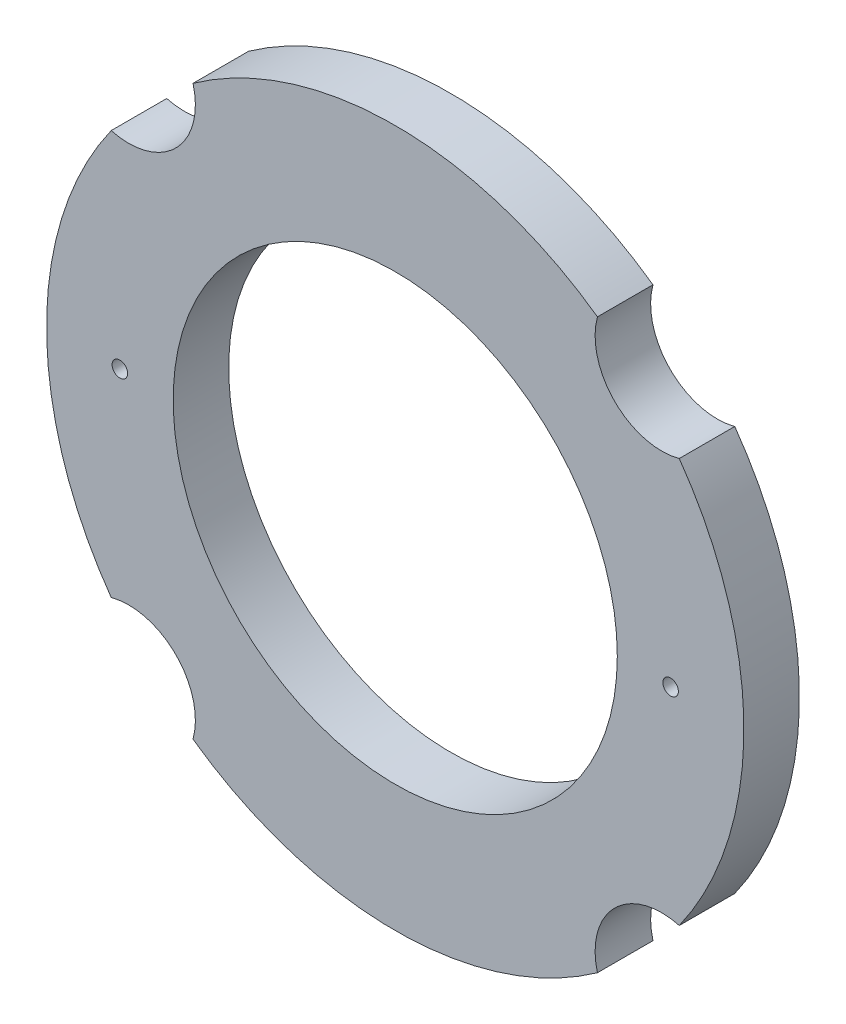
ISO-10303-21;
HEADER;
FILE_DESCRIPTION(('STEP AP214'),'2;1');
FILE_NAME('part.step','',(''),(''),'','','');
FILE_SCHEMA(('AUTOMOTIVE_DESIGN { 1 0 10303 214 1 1 1 1 }'));
ENDSEC;
DATA;
#1=APPLICATION_CONTEXT('core data for automotive mechanical design processes');
#2=APPLICATION_PROTOCOL_DEFINITION('international standard','automotive_design',2000,#1);
#3=PRODUCT_CONTEXT('',#1,'mechanical');
#4=PRODUCT('Part','Part','',(#3));
#5=PRODUCT_RELATED_PRODUCT_CATEGORY('part','',(#4));
#6=PRODUCT_DEFINITION_FORMATION('','',#4);
#7=PRODUCT_DEFINITION_CONTEXT('part definition',#1,'design');
#8=PRODUCT_DEFINITION('design','',#6,#7);
#9=PRODUCT_DEFINITION_SHAPE('','',#8);
#10=(LENGTH_UNIT() NAMED_UNIT(*) SI_UNIT(.MILLI.,.METRE.));
#11=(NAMED_UNIT(*) PLANE_ANGLE_UNIT() SI_UNIT($,.RADIAN.));
#12=(NAMED_UNIT(*) SI_UNIT($,.STERADIAN.) SOLID_ANGLE_UNIT());
#13=UNCERTAINTY_MEASURE_WITH_UNIT(LENGTH_MEASURE(1.E-05),#10,'distance_accuracy_value','');
#14=(GEOMETRIC_REPRESENTATION_CONTEXT(3) GLOBAL_UNCERTAINTY_ASSIGNED_CONTEXT((#13)) GLOBAL_UNIT_ASSIGNED_CONTEXT((#10,
#11,#12)) REPRESENTATION_CONTEXT('',''));
#15=CARTESIAN_POINT('',(0.,0.,0.));
#16=DIRECTION('',(0.,0.,1.));
#17=DIRECTION('',(1.,0.,0.));
#18=AXIS2_PLACEMENT_3D('',#15,#16,#17);
#19=CARTESIAN_POINT('',(0.,0.,0.));
#20=DIRECTION('',(0.,0.,1.));
#21=DIRECTION('',(1.,0.,0.));
#22=AXIS2_PLACEMENT_3D('',#19,#20,#21);
#23=PLANE('',#22);
#24=CARTESIAN_POINT('',(0.,0.,0.));
#25=DIRECTION('',(0.,0.,1.));
#26=DIRECTION('',(1.,0.,0.));
#27=AXIS2_PLACEMENT_3D('',#24,#25,#26);
#28=CIRCLE('',#27,50.);
#29=CARTESIAN_POINT('',(50.,0.,0.));
#30=VERTEX_POINT('',#29);
#31=EDGE_CURVE('E164',#30,#30,#28,.T.);
#32=ORIENTED_EDGE('',*,*,#31,.T.);
#33=EDGE_LOOP('',(#32));
#34=FACE_BOUND('',#33,.T.);
#35=CARTESIAN_POINT('',(-60.0000000000006,-59.9999999999993,0.));
#36=DIRECTION('',(0.,0.,1.));
#37=DIRECTION('',(1.,0.,0.));
#38=AXIS2_PLACEMENT_3D('',#35,#36,#37);
#39=CIRCLE('',#38,15.);
#40=CARTESIAN_POINT('',(-45.5289240738138,-63.9481592595197,0.));
#41=VERTEX_POINT('',#40);
#42=CARTESIAN_POINT('',(-63.9481592595207,-45.5289240738124,0.));
#43=VERTEX_POINT('',#42);
#44=EDGE_CURVE('E147',#41,#43,#39,.T.);
#45=ORIENTED_EDGE('',*,*,#44,.T.);
#46=CARTESIAN_POINT('',(0.,0.,0.));
#47=DIRECTION('',(0.,0.,1.));
#48=DIRECTION('',(1.,0.,0.));
#49=AXIS2_PLACEMENT_3D('',#46,#47,#48);
#50=CIRCLE('',#49,78.5);
#51=CARTESIAN_POINT('',(-63.9481592595202,45.5289240738131,0.));
#52=VERTEX_POINT('',#51);
#53=EDGE_CURVE('E155',#52,#43,#50,.T.);
#54=ORIENTED_EDGE('',*,*,#53,.F.);
#55=CARTESIAN_POINT('',(-60.,60.,0.));
#56=DIRECTION('',(0.,0.,1.));
#57=DIRECTION('',(1.,0.,0.));
#58=AXIS2_PLACEMENT_3D('',#55,#56,#57);
#59=CIRCLE('',#58,15.);
#60=CARTESIAN_POINT('',(-45.5289240738131,63.9481592595202,0.));
#61=VERTEX_POINT('',#60);
#62=EDGE_CURVE('E162',#52,#61,#59,.T.);
#63=ORIENTED_EDGE('',*,*,#62,.T.);
#64=CARTESIAN_POINT('',(45.5289240738134,63.94815925952,0.));
#65=VERTEX_POINT('',#64);
#66=EDGE_CURVE('E126',#65,#61,#50,.T.);
#67=ORIENTED_EDGE('',*,*,#66,.F.);
#68=CARTESIAN_POINT('',(60.0000000000002,59.9999999999998,0.));
#69=DIRECTION('',(0.,0.,1.));
#70=DIRECTION('',(1.,0.,0.));
#71=AXIS2_PLACEMENT_3D('',#68,#69,#70);
#72=CIRCLE('',#71,15.);
#73=CARTESIAN_POINT('',(63.9481592595204,45.5289240738129,0.));
#74=VERTEX_POINT('',#73);
#75=EDGE_CURVE('E159',#65,#74,#72,.T.);
#76=ORIENTED_EDGE('',*,*,#75,.T.);
#77=CARTESIAN_POINT('',(63.9481592595199,-45.5289240738136,0.));
#78=VERTEX_POINT('',#77);
#79=EDGE_CURVE('E156',#78,#74,#50,.T.);
#80=ORIENTED_EDGE('',*,*,#79,.F.);
#81=CARTESIAN_POINT('',(59.9999999999996,-60.0000000000004,0.));
#82=DIRECTION('',(0.,0.,1.));
#83=DIRECTION('',(1.,0.,0.));
#84=AXIS2_PLACEMENT_3D('',#81,#82,#83);
#85=CIRCLE('',#84,15.);
#86=CARTESIAN_POINT('',(45.5289240738127,-63.9481592595205,0.));
#87=VERTEX_POINT('',#86);
#88=EDGE_CURVE('E154',#78,#87,#85,.T.);
#89=ORIENTED_EDGE('',*,*,#88,.T.);
#90=EDGE_CURVE('E150',#41,#87,#50,.T.);
#91=ORIENTED_EDGE('',*,*,#90,.F.);
#92=EDGE_LOOP('',(#45,#54,#63,#67,#76,#80,#89,#91));
#93=FACE_BOUND('',#92,.T.);
#94=CARTESIAN_POINT('',(62.,0.,0.));
#95=DIRECTION('',(0.,0.,1.));
#96=DIRECTION('',(1.,0.,0.));
#97=AXIS2_PLACEMENT_3D('',#94,#95,#96);
#98=CIRCLE('',#97,5.);
#99=CARTESIAN_POINT('',(67.,0.,0.));
#100=VERTEX_POINT('',#99);
#101=EDGE_CURVE('E330',#100,#100,#98,.F.);
#102=ORIENTED_EDGE('',*,*,#101,.F.);
#103=EDGE_LOOP('',(#102));
#104=FACE_BOUND('',#103,.T.);
#105=CARTESIAN_POINT('',(-62.,0.,0.));
#106=DIRECTION('',(0.,0.,1.));
#107=DIRECTION('',(1.,0.,0.));
#108=AXIS2_PLACEMENT_3D('',#105,#106,#107);
#109=CIRCLE('',#108,5.);
#110=CARTESIAN_POINT('',(-57.,0.,0.));
#111=VERTEX_POINT('',#110);
#112=EDGE_CURVE('E321',#111,#111,#109,.T.);
#113=ORIENTED_EDGE('',*,*,#112,.T.);
#114=EDGE_LOOP('',(#113));
#115=FACE_BOUND('',#114,.T.);
#116=ADVANCED_FACE('F41',(#34,#93,#104,#115),#23,.F.);
#117=CARTESIAN_POINT('',(-60.0000000000006,-59.9999999999993,12.5));
#118=DIRECTION('',(0.,0.,-1.));
#119=DIRECTION('',(-1.,0.,0.));
#120=AXIS2_PLACEMENT_3D('',#117,#118,#119);
#121=CYLINDRICAL_SURFACE('',#120,15.);
#122=ORIENTED_EDGE('',*,*,#44,.F.);
#123=DIRECTION('',(0.,0.,-1.));
#124=VECTOR('',#123,1.);
#125=CARTESIAN_POINT('',(-45.5289240738138,-63.9481592595197,12.5));
#126=LINE('',#125,#124);
#127=CARTESIAN_POINT('',(-45.5289240738138,-63.9481592595197,12.5));
#128=VERTEX_POINT('',#127);
#129=EDGE_CURVE('E11',#128,#41,#126,.T.);
#130=ORIENTED_EDGE('',*,*,#129,.F.);
#131=CARTESIAN_POINT('',(-60.0000000000006,-59.9999999999993,12.5));
#132=DIRECTION('',(0.,0.,1.));
#133=DIRECTION('',(1.,0.,0.));
#134=AXIS2_PLACEMENT_3D('',#131,#132,#133);
#135=CIRCLE('',#134,15.);
#136=CARTESIAN_POINT('',(-63.9481592595207,-45.5289240738124,12.5));
#137=VERTEX_POINT('',#136);
#138=EDGE_CURVE('E167',#128,#137,#135,.T.);
#139=ORIENTED_EDGE('',*,*,#138,.T.);
#140=DIRECTION('',(0.,0.,-1.));
#141=VECTOR('',#140,1.);
#142=CARTESIAN_POINT('',(-63.9481592595207,-45.5289240738124,12.5));
#143=LINE('',#142,#141);
#144=EDGE_CURVE('E92',#137,#43,#143,.T.);
#145=ORIENTED_EDGE('',*,*,#144,.T.);
#146=EDGE_LOOP('',(#122,#130,#139,#145));
#147=FACE_BOUND('',#146,.T.);
#148=ADVANCED_FACE('F43',(#147),#121,.F.);
#149=CARTESIAN_POINT('',(0.,0.,12.5));
#150=DIRECTION('',(0.,0.,-1.));
#151=DIRECTION('',(-1.,0.,0.));
#152=AXIS2_PLACEMENT_3D('',#149,#150,#151);
#153=CYLINDRICAL_SURFACE('',#152,78.5);
#154=ORIENTED_EDGE('',*,*,#90,.T.);
#155=DIRECTION('',(0.,0.,-1.));
#156=VECTOR('',#155,1.);
#157=CARTESIAN_POINT('',(45.5289240738127,-63.9481592595205,12.5));
#158=LINE('',#157,#156);
#159=CARTESIAN_POINT('',(45.5289240738127,-63.9481592595205,12.5));
#160=VERTEX_POINT('',#159);
#161=EDGE_CURVE('E50',#160,#87,#158,.T.);
#162=ORIENTED_EDGE('',*,*,#161,.F.);
#163=CARTESIAN_POINT('',(0.,0.,12.5));
#164=DIRECTION('',(0.,0.,1.));
#165=DIRECTION('',(1.,0.,0.));
#166=AXIS2_PLACEMENT_3D('',#163,#164,#165);
#167=CIRCLE('',#166,78.5);
#168=EDGE_CURVE('E135',#128,#160,#167,.T.);
#169=ORIENTED_EDGE('',*,*,#168,.F.);
#170=ORIENTED_EDGE('',*,*,#129,.T.);
#171=EDGE_LOOP('',(#154,#162,#169,#170));
#172=FACE_BOUND('',#171,.T.);
#173=ADVANCED_FACE('F183',(#172),#153,.T.);
#174=CARTESIAN_POINT('',(59.9999999999996,-60.0000000000004,12.5));
#175=DIRECTION('',(0.,0.,-1.));
#176=DIRECTION('',(-1.,0.,0.));
#177=AXIS2_PLACEMENT_3D('',#174,#175,#176);
#178=CYLINDRICAL_SURFACE('',#177,15.);
#179=ORIENTED_EDGE('',*,*,#88,.F.);
#180=DIRECTION('',(0.,0.,-1.));
#181=VECTOR('',#180,1.);
#182=CARTESIAN_POINT('',(63.9481592595199,-45.5289240738136,12.5));
#183=LINE('',#182,#181);
#184=CARTESIAN_POINT('',(63.9481592595199,-45.5289240738136,12.5));
#185=VERTEX_POINT('',#184);
#186=EDGE_CURVE('E173',#185,#78,#183,.T.);
#187=ORIENTED_EDGE('',*,*,#186,.F.);
#188=CARTESIAN_POINT('',(59.9999999999996,-60.0000000000004,12.5));
#189=DIRECTION('',(0.,0.,1.));
#190=DIRECTION('',(1.,0.,0.));
#191=AXIS2_PLACEMENT_3D('',#188,#189,#190);
#192=CIRCLE('',#191,15.);
#193=EDGE_CURVE('E180',#185,#160,#192,.T.);
#194=ORIENTED_EDGE('',*,*,#193,.T.);
#195=ORIENTED_EDGE('',*,*,#161,.T.);
#196=EDGE_LOOP('',(#179,#187,#194,#195));
#197=FACE_BOUND('',#196,.T.);
#198=ADVANCED_FACE('F178',(#197),#178,.F.);
#199=ORIENTED_EDGE('',*,*,#79,.T.);
#200=DIRECTION('',(0.,0.,-1.));
#201=VECTOR('',#200,1.);
#202=CARTESIAN_POINT('',(63.9481592595204,45.5289240738129,12.5));
#203=LINE('',#202,#201);
#204=CARTESIAN_POINT('',(63.9481592595204,45.5289240738129,12.5));
#205=VERTEX_POINT('',#204);
#206=EDGE_CURVE('E171',#205,#74,#203,.T.);
#207=ORIENTED_EDGE('',*,*,#206,.F.);
#208=EDGE_CURVE('E121',#185,#205,#167,.T.);
#209=ORIENTED_EDGE('',*,*,#208,.F.);
#210=ORIENTED_EDGE('',*,*,#186,.T.);
#211=EDGE_LOOP('',(#199,#207,#209,#210));
#212=FACE_BOUND('',#211,.T.);
#213=ADVANCED_FACE('F197',(#212),#153,.T.);
#214=CARTESIAN_POINT('',(60.0000000000002,59.9999999999998,12.5));
#215=DIRECTION('',(0.,0.,-1.));
#216=DIRECTION('',(-1.,0.,0.));
#217=AXIS2_PLACEMENT_3D('',#214,#215,#216);
#218=CYLINDRICAL_SURFACE('',#217,15.);
#219=ORIENTED_EDGE('',*,*,#75,.F.);
#220=DIRECTION('',(0.,0.,-1.));
#221=VECTOR('',#220,1.);
#222=CARTESIAN_POINT('',(45.5289240738134,63.94815925952,12.5));
#223=LINE('',#222,#221);
#224=CARTESIAN_POINT('',(45.5289240738134,63.94815925952,12.5));
#225=VERTEX_POINT('',#224);
#226=EDGE_CURVE('E130',#225,#65,#223,.T.);
#227=ORIENTED_EDGE('',*,*,#226,.F.);
#228=CARTESIAN_POINT('',(60.0000000000002,59.9999999999998,12.5));
#229=DIRECTION('',(0.,0.,1.));
#230=DIRECTION('',(1.,0.,0.));
#231=AXIS2_PLACEMENT_3D('',#228,#229,#230);
#232=CIRCLE('',#231,15.);
#233=EDGE_CURVE('E118',#225,#205,#232,.T.);
#234=ORIENTED_EDGE('',*,*,#233,.T.);
#235=ORIENTED_EDGE('',*,*,#206,.T.);
#236=EDGE_LOOP('',(#219,#227,#234,#235));
#237=FACE_BOUND('',#236,.T.);
#238=ADVANCED_FACE('F222',(#237),#218,.F.);
#239=ORIENTED_EDGE('',*,*,#66,.T.);
#240=DIRECTION('',(0.,0.,-1.));
#241=VECTOR('',#240,1.);
#242=CARTESIAN_POINT('',(-45.5289240738131,63.9481592595202,12.5));
#243=LINE('',#242,#241);
#244=CARTESIAN_POINT('',(-45.5289240738131,63.9481592595202,12.5));
#245=VERTEX_POINT('',#244);
#246=EDGE_CURVE('E123',#245,#61,#243,.T.);
#247=ORIENTED_EDGE('',*,*,#246,.F.);
#248=EDGE_CURVE('E111',#225,#245,#167,.T.);
#249=ORIENTED_EDGE('',*,*,#248,.F.);
#250=ORIENTED_EDGE('',*,*,#226,.T.);
#251=EDGE_LOOP('',(#239,#247,#249,#250));
#252=FACE_BOUND('',#251,.T.);
#253=ADVANCED_FACE('F124',(#252),#153,.T.);
#254=CARTESIAN_POINT('',(-60.,60.,12.5));
#255=DIRECTION('',(0.,0.,-1.));
#256=DIRECTION('',(-1.,0.,0.));
#257=AXIS2_PLACEMENT_3D('',#254,#255,#256);
#258=CYLINDRICAL_SURFACE('',#257,15.);
#259=ORIENTED_EDGE('',*,*,#62,.F.);
#260=DIRECTION('',(0.,0.,-1.));
#261=VECTOR('',#260,1.);
#262=CARTESIAN_POINT('',(-63.9481592595202,45.5289240738131,12.5));
#263=LINE('',#262,#261);
#264=CARTESIAN_POINT('',(-63.9481592595202,45.5289240738131,12.5));
#265=VERTEX_POINT('',#264);
#266=EDGE_CURVE('E85',#265,#52,#263,.T.);
#267=ORIENTED_EDGE('',*,*,#266,.F.);
#268=CARTESIAN_POINT('',(-60.,60.,12.5));
#269=DIRECTION('',(0.,0.,1.));
#270=DIRECTION('',(1.,0.,0.));
#271=AXIS2_PLACEMENT_3D('',#268,#269,#270);
#272=CIRCLE('',#271,15.);
#273=EDGE_CURVE('E116',#265,#245,#272,.T.);
#274=ORIENTED_EDGE('',*,*,#273,.T.);
#275=ORIENTED_EDGE('',*,*,#246,.T.);
#276=EDGE_LOOP('',(#259,#267,#274,#275));
#277=FACE_BOUND('',#276,.T.);
#278=ADVANCED_FACE('F132',(#277),#258,.F.);
#279=CARTESIAN_POINT('',(62.,0.,12.5));
#280=DIRECTION('',(0.,0.,-1.));
#281=DIRECTION('',(-1.,0.,0.));
#282=AXIS2_PLACEMENT_3D('',#279,#280,#281);
#283=CYLINDRICAL_SURFACE('',#282,1.75);
#284=CARTESIAN_POINT('',(62.,0.,4.));
#285=DIRECTION('',(0.,0.,1.));
#286=DIRECTION('',(1.,0.,0.));
#287=AXIS2_PLACEMENT_3D('',#284,#285,#286);
#288=CIRCLE('',#287,1.75);
#289=CARTESIAN_POINT('',(63.75,0.,4.));
#290=VERTEX_POINT('',#289);
#291=EDGE_CURVE('E327',#290,#290,#288,.T.);
#292=ORIENTED_EDGE('',*,*,#291,.F.);
#293=EDGE_LOOP('',(#292));
#294=FACE_BOUND('',#293,.T.);
#295=CARTESIAN_POINT('',(62.,0.,12.5));
#296=DIRECTION('',(0.,0.,1.));
#297=DIRECTION('',(1.,0.,0.));
#298=AXIS2_PLACEMENT_3D('',#295,#296,#297);
#299=CIRCLE('',#298,1.75);
#300=CARTESIAN_POINT('',(63.75,0.,12.5));
#301=VERTEX_POINT('',#300);
#302=EDGE_CURVE('E141',#301,#301,#299,.T.);
#303=ORIENTED_EDGE('',*,*,#302,.T.);
#304=EDGE_LOOP('',(#303));
#305=FACE_BOUND('',#304,.T.);
#306=ADVANCED_FACE('F212',(#294,#305),#283,.F.);
#307=CARTESIAN_POINT('',(0.,0.,12.5));
#308=DIRECTION('',(0.,0.,-1.));
#309=DIRECTION('',(-1.,0.,0.));
#310=AXIS2_PLACEMENT_3D('',#307,#308,#309);
#311=CYLINDRICAL_SURFACE('',#310,50.);
#312=CARTESIAN_POINT('',(0.,0.,12.5));
#313=DIRECTION('',(0.,0.,1.));
#314=DIRECTION('',(1.,0.,0.));
#315=AXIS2_PLACEMENT_3D('',#312,#313,#314);
#316=CIRCLE('',#315,50.);
#317=CARTESIAN_POINT('',(50.,0.,12.5));
#318=VERTEX_POINT('',#317);
#319=EDGE_CURVE('E134',#318,#318,#316,.T.);
#320=ORIENTED_EDGE('',*,*,#319,.T.);
#321=EDGE_LOOP('',(#320));
#322=FACE_BOUND('',#321,.T.);
#323=ORIENTED_EDGE('',*,*,#31,.F.);
#324=EDGE_LOOP('',(#323));
#325=FACE_BOUND('',#324,.T.);
#326=ADVANCED_FACE('F214',(#322,#325),#311,.F.);
#327=ORIENTED_EDGE('',*,*,#53,.T.);
#328=ORIENTED_EDGE('',*,*,#144,.F.);
#329=EDGE_CURVE('E58',#265,#137,#167,.T.);
#330=ORIENTED_EDGE('',*,*,#329,.F.);
#331=ORIENTED_EDGE('',*,*,#266,.T.);
#332=EDGE_LOOP('',(#327,#328,#330,#331));
#333=FACE_BOUND('',#332,.T.);
#334=ADVANCED_FACE('F191',(#333),#153,.T.);
#335=CARTESIAN_POINT('',(-62.,0.,12.5));
#336=DIRECTION('',(0.,0.,-1.));
#337=DIRECTION('',(-1.,0.,0.));
#338=AXIS2_PLACEMENT_3D('',#335,#336,#337);
#339=CYLINDRICAL_SURFACE('',#338,1.75);
#340=CARTESIAN_POINT('',(-62.,0.,4.));
#341=DIRECTION('',(0.,0.,1.));
#342=DIRECTION('',(1.,0.,0.));
#343=AXIS2_PLACEMENT_3D('',#340,#341,#342);
#344=CIRCLE('',#343,1.75);
#345=CARTESIAN_POINT('',(-60.25,0.,4.));
#346=VERTEX_POINT('',#345);
#347=EDGE_CURVE('E317',#346,#346,#344,.T.);
#348=ORIENTED_EDGE('',*,*,#347,.F.);
#349=EDGE_LOOP('',(#348));
#350=FACE_BOUND('',#349,.T.);
#351=CARTESIAN_POINT('',(-62.,0.,12.5));
#352=DIRECTION('',(0.,0.,1.));
#353=DIRECTION('',(1.,0.,0.));
#354=AXIS2_PLACEMENT_3D('',#351,#352,#353);
#355=CIRCLE('',#354,1.75);
#356=CARTESIAN_POINT('',(-60.25,0.,12.5));
#357=VERTEX_POINT('',#356);
#358=EDGE_CURVE('E144',#357,#357,#355,.T.);
#359=ORIENTED_EDGE('',*,*,#358,.T.);
#360=EDGE_LOOP('',(#359));
#361=FACE_BOUND('',#360,.T.);
#362=ADVANCED_FACE('F208',(#350,#361),#339,.F.);
#363=CARTESIAN_POINT('',(0.,0.,12.5));
#364=DIRECTION('',(0.,0.,1.));
#365=DIRECTION('',(1.,0.,0.));
#366=AXIS2_PLACEMENT_3D('',#363,#364,#365);
#367=PLANE('',#366);
#368=ORIENTED_EDGE('',*,*,#138,.F.);
#369=ORIENTED_EDGE('',*,*,#168,.T.);
#370=ORIENTED_EDGE('',*,*,#193,.F.);
#371=ORIENTED_EDGE('',*,*,#208,.T.);
#372=ORIENTED_EDGE('',*,*,#233,.F.);
#373=ORIENTED_EDGE('',*,*,#248,.T.);
#374=ORIENTED_EDGE('',*,*,#273,.F.);
#375=ORIENTED_EDGE('',*,*,#329,.T.);
#376=EDGE_LOOP('',(#368,#369,#370,#371,#372,#373,#374,#375));
#377=FACE_BOUND('',#376,.T.);
#378=ORIENTED_EDGE('',*,*,#319,.F.);
#379=EDGE_LOOP('',(#378));
#380=FACE_BOUND('',#379,.T.);
#381=ORIENTED_EDGE('',*,*,#302,.F.);
#382=EDGE_LOOP('',(#381));
#383=FACE_BOUND('',#382,.T.);
#384=ORIENTED_EDGE('',*,*,#358,.F.);
#385=EDGE_LOOP('',(#384));
#386=FACE_BOUND('',#385,.T.);
#387=ADVANCED_FACE('F113',(#377,#380,#383,#386),#367,.T.);
#388=CARTESIAN_POINT('',(62.,0.,4.));
#389=DIRECTION('',(0.,0.,-1.));
#390=DIRECTION('',(-1.,0.,0.));
#391=AXIS2_PLACEMENT_3D('',#388,#389,#390);
#392=CYLINDRICAL_SURFACE('',#391,5.);
#393=CARTESIAN_POINT('',(62.,0.,4.));
#394=DIRECTION('',(0.,0.,1.));
#395=DIRECTION('',(1.,0.,0.));
#396=AXIS2_PLACEMENT_3D('',#393,#394,#395);
#397=CIRCLE('',#396,5.);
#398=CARTESIAN_POINT('',(67.,0.,4.));
#399=VERTEX_POINT('',#398);
#400=EDGE_CURVE('E326',#399,#399,#397,.F.);
#401=ORIENTED_EDGE('',*,*,#400,.F.);
#402=EDGE_LOOP('',(#401));
#403=FACE_BOUND('',#402,.T.);
#404=ORIENTED_EDGE('',*,*,#101,.T.);
#405=EDGE_LOOP('',(#404));
#406=FACE_BOUND('',#405,.T.);
#407=ADVANCED_FACE('F258',(#403,#406),#392,.F.);
#408=CARTESIAN_POINT('',(0.,0.,4.));
#409=DIRECTION('',(0.,0.,1.));
#410=DIRECTION('',(1.,0.,0.));
#411=AXIS2_PLACEMENT_3D('',#408,#409,#410);
#412=PLANE('',#411);
#413=ORIENTED_EDGE('',*,*,#291,.T.);
#414=EDGE_LOOP('',(#413));
#415=FACE_BOUND('',#414,.T.);
#416=ORIENTED_EDGE('',*,*,#400,.T.);
#417=EDGE_LOOP('',(#416));
#418=FACE_BOUND('',#417,.T.);
#419=ADVANCED_FACE('F282',(#415,#418),#412,.F.);
#420=CARTESIAN_POINT('',(-62.,0.,4.));
#421=DIRECTION('',(0.,0.,-1.));
#422=DIRECTION('',(-1.,0.,0.));
#423=AXIS2_PLACEMENT_3D('',#420,#421,#422);
#424=CYLINDRICAL_SURFACE('',#423,5.);
#425=CARTESIAN_POINT('',(-62.,0.,4.));
#426=DIRECTION('',(0.,0.,1.));
#427=DIRECTION('',(1.,0.,0.));
#428=AXIS2_PLACEMENT_3D('',#425,#426,#427);
#429=CIRCLE('',#428,5.);
#430=CARTESIAN_POINT('',(-57.,0.,4.));
#431=VERTEX_POINT('',#430);
#432=EDGE_CURVE('E151',#431,#431,#429,.T.);
#433=ORIENTED_EDGE('',*,*,#432,.T.);
#434=EDGE_LOOP('',(#433));
#435=FACE_BOUND('',#434,.T.);
#436=ORIENTED_EDGE('',*,*,#112,.F.);
#437=EDGE_LOOP('',(#436));
#438=FACE_BOUND('',#437,.T.);
#439=ADVANCED_FACE('F291',(#435,#438),#424,.F.);
#440=CARTESIAN_POINT('',(0.,0.,4.));
#441=DIRECTION('',(0.,0.,1.));
#442=DIRECTION('',(1.,0.,0.));
#443=AXIS2_PLACEMENT_3D('',#440,#441,#442);
#444=PLANE('',#443);
#445=ORIENTED_EDGE('',*,*,#347,.T.);
#446=EDGE_LOOP('',(#445));
#447=FACE_BOUND('',#446,.T.);
#448=ORIENTED_EDGE('',*,*,#432,.F.);
#449=EDGE_LOOP('',(#448));
#450=FACE_BOUND('',#449,.T.);
#451=ADVANCED_FACE('F301',(#447,#450),#444,.F.);
#452=CLOSED_SHELL('',(#116,#148,#173,#198,#213,#238,#253,#278,#306,#326,#334,#362,#387,#407,
#419,#439,#451));
#453=MANIFOLD_SOLID_BREP('B2',#452);
#454=ADVANCED_BREP_SHAPE_REPRESENTATION('',(#18,#453),#14);
#455=SHAPE_DEFINITION_REPRESENTATION(#9,#454);
ENDSEC;
END-ISO-10303-21;
